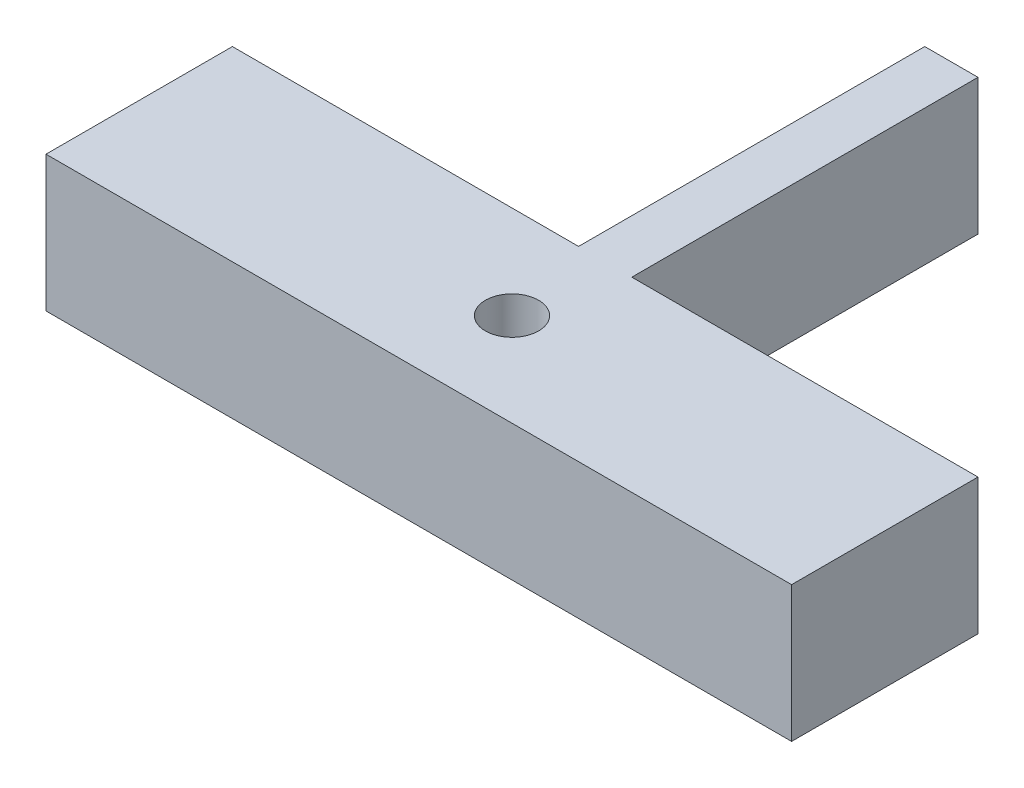
ISO-10303-21;
HEADER;
FILE_DESCRIPTION(('STEP AP214'),'2;1');
FILE_NAME('part.step','',(''),(''),'','','');
FILE_SCHEMA(('AUTOMOTIVE_DESIGN { 1 0 10303 214 1 1 1 1 }'));
ENDSEC;
DATA;
#1=APPLICATION_CONTEXT('core data for automotive mechanical design processes');
#2=APPLICATION_PROTOCOL_DEFINITION('international standard','automotive_design',2000,#1);
#3=PRODUCT_CONTEXT('',#1,'mechanical');
#4=PRODUCT('Part','Part','',(#3));
#5=PRODUCT_RELATED_PRODUCT_CATEGORY('part','',(#4));
#6=PRODUCT_DEFINITION_FORMATION('','',#4);
#7=PRODUCT_DEFINITION_CONTEXT('part definition',#1,'design');
#8=PRODUCT_DEFINITION('design','',#6,#7);
#9=PRODUCT_DEFINITION_SHAPE('','',#8);
#10=(LENGTH_UNIT() NAMED_UNIT(*) SI_UNIT(.MILLI.,.METRE.));
#11=(NAMED_UNIT(*) PLANE_ANGLE_UNIT() SI_UNIT($,.RADIAN.));
#12=(NAMED_UNIT(*) SI_UNIT($,.STERADIAN.) SOLID_ANGLE_UNIT());
#13=UNCERTAINTY_MEASURE_WITH_UNIT(LENGTH_MEASURE(1.E-05),#10,'distance_accuracy_value','');
#14=(GEOMETRIC_REPRESENTATION_CONTEXT(3) GLOBAL_UNCERTAINTY_ASSIGNED_CONTEXT((#13)) GLOBAL_UNIT_ASSIGNED_CONTEXT((#10,
#11,#12)) REPRESENTATION_CONTEXT('',''));
#15=CARTESIAN_POINT('',(0.,0.,0.));
#16=DIRECTION('',(0.,0.,1.));
#17=DIRECTION('',(1.,0.,0.));
#18=AXIS2_PLACEMENT_3D('',#15,#16,#17);
#19=CARTESIAN_POINT('',(-10.,25.5,-100.));
#20=DIRECTION('',(1.,0.,0.));
#21=DIRECTION('',(0.,0.,-1.));
#22=AXIS2_PLACEMENT_3D('',#19,#20,#21);
#23=PLANE('',#22);
#24=DIRECTION('',(0.,0.,1.));
#25=VECTOR('',#24,1.);
#26=CARTESIAN_POINT('',(-10.,-25.5,-100.));
#27=LINE('',#26,#25);
#28=CARTESIAN_POINT('',(-10.,-25.5,-100.));
#29=VERTEX_POINT('',#28);
#30=CARTESIAN_POINT('',(-9.99999999999996,-25.5,30.));
#31=VERTEX_POINT('',#30);
#32=EDGE_CURVE('E131',#29,#31,#27,.T.);
#33=ORIENTED_EDGE('',*,*,#32,.T.);
#34=DIRECTION('',(0.,-1.,0.));
#35=VECTOR('',#34,1.);
#36=CARTESIAN_POINT('',(-9.99999999999996,25.5,30.));
#37=LINE('',#36,#35);
#38=CARTESIAN_POINT('',(-9.99999999999996,25.5,30.));
#39=VERTEX_POINT('',#38);
#40=EDGE_CURVE('E11',#39,#31,#37,.T.);
#41=ORIENTED_EDGE('',*,*,#40,.F.);
#42=DIRECTION('',(0.,0.,1.));
#43=VECTOR('',#42,1.);
#44=CARTESIAN_POINT('',(-10.,25.5,-100.));
#45=LINE('',#44,#43);
#46=CARTESIAN_POINT('',(-10.,25.5,-100.));
#47=VERTEX_POINT('',#46);
#48=EDGE_CURVE('E146',#47,#39,#45,.T.);
#49=ORIENTED_EDGE('',*,*,#48,.F.);
#50=DIRECTION('',(0.,-1.,0.));
#51=VECTOR('',#50,1.);
#52=CARTESIAN_POINT('',(-10.,25.5,-100.));
#53=LINE('',#52,#51);
#54=EDGE_CURVE('E127',#47,#29,#53,.T.);
#55=ORIENTED_EDGE('',*,*,#54,.T.);
#56=EDGE_LOOP('',(#33,#41,#49,#55));
#57=FACE_BOUND('',#56,.T.);
#58=ADVANCED_FACE('F35',(#57),#23,.F.);
#59=CARTESIAN_POINT('',(-9.99999999999996,25.5,30.));
#60=DIRECTION('',(0.,0.,1.));
#61=DIRECTION('',(1.,0.,0.));
#62=AXIS2_PLACEMENT_3D('',#59,#60,#61);
#63=PLANE('',#62);
#64=DIRECTION('',(-1.,0.,0.));
#65=VECTOR('',#64,1.);
#66=CARTESIAN_POINT('',(-9.99999999999996,-25.5,30.));
#67=LINE('',#66,#65);
#68=CARTESIAN_POINT('',(-140.,-25.5,30.));
#69=VERTEX_POINT('',#68);
#70=EDGE_CURVE('E134',#31,#69,#67,.T.);
#71=ORIENTED_EDGE('',*,*,#70,.T.);
#72=DIRECTION('',(0.,-1.,0.));
#73=VECTOR('',#72,1.);
#74=CARTESIAN_POINT('',(-140.,25.5,30.));
#75=LINE('',#74,#73);
#76=CARTESIAN_POINT('',(-140.,25.5,30.));
#77=VERTEX_POINT('',#76);
#78=EDGE_CURVE('E43',#77,#69,#75,.T.);
#79=ORIENTED_EDGE('',*,*,#78,.F.);
#80=DIRECTION('',(-1.,0.,0.));
#81=VECTOR('',#80,1.);
#82=CARTESIAN_POINT('',(-9.99999999999996,25.5,30.));
#83=LINE('',#82,#81);
#84=EDGE_CURVE('E94',#39,#77,#83,.T.);
#85=ORIENTED_EDGE('',*,*,#84,.F.);
#86=ORIENTED_EDGE('',*,*,#40,.T.);
#87=EDGE_LOOP('',(#71,#79,#85,#86));
#88=FACE_BOUND('',#87,.T.);
#89=ADVANCED_FACE('F200',(#88),#63,.F.);
#90=CARTESIAN_POINT('',(-140.,25.5,30.));
#91=DIRECTION('',(1.,0.,0.));
#92=DIRECTION('',(0.,0.,-1.));
#93=AXIS2_PLACEMENT_3D('',#90,#91,#92);
#94=PLANE('',#93);
#95=DIRECTION('',(0.,0.,1.));
#96=VECTOR('',#95,1.);
#97=CARTESIAN_POINT('',(-140.,-25.5,30.));
#98=LINE('',#97,#96);
#99=CARTESIAN_POINT('',(-140.,-25.5,100.));
#100=VERTEX_POINT('',#99);
#101=EDGE_CURVE('E137',#69,#100,#98,.T.);
#102=ORIENTED_EDGE('',*,*,#101,.T.);
#103=DIRECTION('',(0.,-1.,0.));
#104=VECTOR('',#103,1.);
#105=CARTESIAN_POINT('',(-140.,25.5,100.));
#106=LINE('',#105,#104);
#107=CARTESIAN_POINT('',(-140.,25.5,100.));
#108=VERTEX_POINT('',#107);
#109=EDGE_CURVE('E153',#108,#100,#106,.T.);
#110=ORIENTED_EDGE('',*,*,#109,.F.);
#111=DIRECTION('',(0.,0.,1.));
#112=VECTOR('',#111,1.);
#113=CARTESIAN_POINT('',(-140.,25.5,30.));
#114=LINE('',#113,#112);
#115=EDGE_CURVE('E161',#77,#108,#114,.T.);
#116=ORIENTED_EDGE('',*,*,#115,.F.);
#117=ORIENTED_EDGE('',*,*,#78,.T.);
#118=EDGE_LOOP('',(#102,#110,#116,#117));
#119=FACE_BOUND('',#118,.T.);
#120=ADVANCED_FACE('F159',(#119),#94,.F.);
#121=CARTESIAN_POINT('',(-140.,25.5,100.));
#122=DIRECTION('',(0.,0.,-1.));
#123=DIRECTION('',(-1.,0.,0.));
#124=AXIS2_PLACEMENT_3D('',#121,#122,#123);
#125=PLANE('',#124);
#126=DIRECTION('',(1.,0.,0.));
#127=VECTOR('',#126,1.);
#128=CARTESIAN_POINT('',(-140.,-25.5,100.));
#129=LINE('',#128,#127);
#130=CARTESIAN_POINT('',(140.,-25.5,100.));
#131=VERTEX_POINT('',#130);
#132=EDGE_CURVE('E139',#100,#131,#129,.T.);
#133=ORIENTED_EDGE('',*,*,#132,.T.);
#134=DIRECTION('',(0.,-1.,0.));
#135=VECTOR('',#134,1.);
#136=CARTESIAN_POINT('',(140.,25.5,100.));
#137=LINE('',#136,#135);
#138=CARTESIAN_POINT('',(140.,25.5,100.));
#139=VERTEX_POINT('',#138);
#140=EDGE_CURVE('E150',#139,#131,#137,.T.);
#141=ORIENTED_EDGE('',*,*,#140,.F.);
#142=DIRECTION('',(1.,0.,0.));
#143=VECTOR('',#142,1.);
#144=CARTESIAN_POINT('',(-140.,25.5,100.));
#145=LINE('',#144,#143);
#146=EDGE_CURVE('E173',#108,#139,#145,.T.);
#147=ORIENTED_EDGE('',*,*,#146,.F.);
#148=ORIENTED_EDGE('',*,*,#109,.T.);
#149=EDGE_LOOP('',(#133,#141,#147,#148));
#150=FACE_BOUND('',#149,.T.);
#151=ADVANCED_FACE('F169',(#150),#125,.F.);
#152=CARTESIAN_POINT('',(140.,25.5,30.));
#153=DIRECTION('',(-1.,0.,0.));
#154=DIRECTION('',(0.,0.,1.));
#155=AXIS2_PLACEMENT_3D('',#152,#153,#154);
#156=PLANE('',#155);
#157=DIRECTION('',(0.,0.,-1.));
#158=VECTOR('',#157,1.);
#159=CARTESIAN_POINT('',(140.,-25.5,30.));
#160=LINE('',#159,#158);
#161=CARTESIAN_POINT('',(140.,-25.5,30.));
#162=VERTEX_POINT('',#161);
#163=EDGE_CURVE('E141',#131,#162,#160,.T.);
#164=ORIENTED_EDGE('',*,*,#163,.T.);
#165=DIRECTION('',(0.,-1.,0.));
#166=VECTOR('',#165,1.);
#167=CARTESIAN_POINT('',(140.,25.5,30.));
#168=LINE('',#167,#166);
#169=CARTESIAN_POINT('',(140.,25.5,30.));
#170=VERTEX_POINT('',#169);
#171=EDGE_CURVE('E122',#170,#162,#168,.T.);
#172=ORIENTED_EDGE('',*,*,#171,.F.);
#173=DIRECTION('',(0.,0.,-1.));
#174=VECTOR('',#173,1.);
#175=CARTESIAN_POINT('',(140.,25.5,30.));
#176=LINE('',#175,#174);
#177=EDGE_CURVE('E113',#139,#170,#176,.T.);
#178=ORIENTED_EDGE('',*,*,#177,.F.);
#179=ORIENTED_EDGE('',*,*,#140,.T.);
#180=EDGE_LOOP('',(#164,#172,#178,#179));
#181=FACE_BOUND('',#180,.T.);
#182=ADVANCED_FACE('F172',(#181),#156,.F.);
#183=CARTESIAN_POINT('',(9.99999999999999,25.5,30.));
#184=DIRECTION('',(0.,0.,1.));
#185=DIRECTION('',(1.,0.,0.));
#186=AXIS2_PLACEMENT_3D('',#183,#184,#185);
#187=PLANE('',#186);
#188=DIRECTION('',(-1.,0.,0.));
#189=VECTOR('',#188,1.);
#190=CARTESIAN_POINT('',(9.99999999999999,-25.5,30.));
#191=LINE('',#190,#189);
#192=CARTESIAN_POINT('',(9.99999999999999,-25.5,30.));
#193=VERTEX_POINT('',#192);
#194=EDGE_CURVE('E121',#162,#193,#191,.T.);
#195=ORIENTED_EDGE('',*,*,#194,.T.);
#196=DIRECTION('',(0.,-1.,0.));
#197=VECTOR('',#196,1.);
#198=CARTESIAN_POINT('',(9.99999999999999,25.5,30.));
#199=LINE('',#198,#197);
#200=CARTESIAN_POINT('',(9.99999999999999,25.5,30.));
#201=VERTEX_POINT('',#200);
#202=EDGE_CURVE('E118',#201,#193,#199,.T.);
#203=ORIENTED_EDGE('',*,*,#202,.F.);
#204=DIRECTION('',(-1.,0.,0.));
#205=VECTOR('',#204,1.);
#206=CARTESIAN_POINT('',(9.99999999999999,25.5,30.));
#207=LINE('',#206,#205);
#208=EDGE_CURVE('E107',#170,#201,#207,.T.);
#209=ORIENTED_EDGE('',*,*,#208,.F.);
#210=ORIENTED_EDGE('',*,*,#171,.T.);
#211=EDGE_LOOP('',(#195,#203,#209,#210));
#212=FACE_BOUND('',#211,.T.);
#213=ADVANCED_FACE('F119',(#212),#187,.F.);
#214=CARTESIAN_POINT('',(10.,25.5,-100.));
#215=DIRECTION('',(-1.,0.,0.));
#216=DIRECTION('',(0.,0.,1.));
#217=AXIS2_PLACEMENT_3D('',#214,#215,#216);
#218=PLANE('',#217);
#219=DIRECTION('',(0.,0.,-1.));
#220=VECTOR('',#219,1.);
#221=CARTESIAN_POINT('',(10.,-25.5,-100.));
#222=LINE('',#221,#220);
#223=CARTESIAN_POINT('',(10.,-25.5,-100.));
#224=VERTEX_POINT('',#223);
#225=EDGE_CURVE('E80',#193,#224,#222,.T.);
#226=ORIENTED_EDGE('',*,*,#225,.T.);
#227=DIRECTION('',(0.,-1.,0.));
#228=VECTOR('',#227,1.);
#229=CARTESIAN_POINT('',(10.,25.5,-100.));
#230=LINE('',#229,#228);
#231=CARTESIAN_POINT('',(10.,25.5,-100.));
#232=VERTEX_POINT('',#231);
#233=EDGE_CURVE('E123',#232,#224,#230,.T.);
#234=ORIENTED_EDGE('',*,*,#233,.F.);
#235=DIRECTION('',(0.,0.,-1.));
#236=VECTOR('',#235,1.);
#237=CARTESIAN_POINT('',(10.,25.5,-100.));
#238=LINE('',#237,#236);
#239=EDGE_CURVE('E111',#201,#232,#238,.T.);
#240=ORIENTED_EDGE('',*,*,#239,.F.);
#241=ORIENTED_EDGE('',*,*,#202,.T.);
#242=EDGE_LOOP('',(#226,#234,#240,#241));
#243=FACE_BOUND('',#242,.T.);
#244=ADVANCED_FACE('F125',(#243),#218,.F.);
#245=CARTESIAN_POINT('',(10.,25.5,-100.));
#246=DIRECTION('',(0.,0.,1.));
#247=DIRECTION('',(1.,0.,0.));
#248=AXIS2_PLACEMENT_3D('',#245,#246,#247);
#249=PLANE('',#248);
#250=DIRECTION('',(-1.,0.,0.));
#251=VECTOR('',#250,1.);
#252=CARTESIAN_POINT('',(10.,-25.5,-100.));
#253=LINE('',#252,#251);
#254=EDGE_CURVE('E86',#224,#29,#253,.T.);
#255=ORIENTED_EDGE('',*,*,#254,.T.);
#256=ORIENTED_EDGE('',*,*,#54,.F.);
#257=DIRECTION('',(-1.,0.,0.));
#258=VECTOR('',#257,1.);
#259=CARTESIAN_POINT('',(10.,25.5,-100.));
#260=LINE('',#259,#258);
#261=EDGE_CURVE('E51',#232,#47,#260,.T.);
#262=ORIENTED_EDGE('',*,*,#261,.F.);
#263=ORIENTED_EDGE('',*,*,#233,.T.);
#264=EDGE_LOOP('',(#255,#256,#262,#263));
#265=FACE_BOUND('',#264,.T.);
#266=ADVANCED_FACE('F188',(#265),#249,.F.);
#267=CARTESIAN_POINT('',(0.,25.5,0.));
#268=DIRECTION('',(0.,-1.,0.));
#269=DIRECTION('',(0.,0.,-1.));
#270=AXIS2_PLACEMENT_3D('',#267,#268,#269);
#271=PLANE('',#270);
#272=CARTESIAN_POINT('',(0.,25.5,65.));
#273=DIRECTION('',(0.,1.,0.));
#274=DIRECTION('',(0.,0.,1.));
#275=AXIS2_PLACEMENT_3D('',#272,#273,#274);
#276=CIRCLE('',#275,10.);
#277=CARTESIAN_POINT('',(0.,25.5,75.));
#278=VERTEX_POINT('',#277);
#279=EDGE_CURVE('E181',#278,#278,#276,.T.);
#280=ORIENTED_EDGE('',*,*,#279,.F.);
#281=EDGE_LOOP('',(#280));
#282=FACE_BOUND('',#281,.T.);
#283=ORIENTED_EDGE('',*,*,#48,.T.);
#284=ORIENTED_EDGE('',*,*,#84,.T.);
#285=ORIENTED_EDGE('',*,*,#115,.T.);
#286=ORIENTED_EDGE('',*,*,#146,.T.);
#287=ORIENTED_EDGE('',*,*,#177,.T.);
#288=ORIENTED_EDGE('',*,*,#208,.T.);
#289=ORIENTED_EDGE('',*,*,#239,.T.);
#290=ORIENTED_EDGE('',*,*,#261,.T.);
#291=EDGE_LOOP('',(#283,#284,#285,#286,#287,#288,#289,#290));
#292=FACE_BOUND('',#291,.T.);
#293=ADVANCED_FACE('F109',(#282,#292),#271,.F.);
#294=CARTESIAN_POINT('',(0.,-25.5,0.));
#295=DIRECTION('',(0.,-1.,0.));
#296=DIRECTION('',(0.,0.,-1.));
#297=AXIS2_PLACEMENT_3D('',#294,#295,#296);
#298=PLANE('',#297);
#299=CARTESIAN_POINT('',(0.,-25.5,65.));
#300=DIRECTION('',(0.,1.,0.));
#301=DIRECTION('',(0.,0.,1.));
#302=AXIS2_PLACEMENT_3D('',#299,#300,#301);
#303=CIRCLE('',#302,10.);
#304=CARTESIAN_POINT('',(0.,-25.5,75.));
#305=VERTEX_POINT('',#304);
#306=EDGE_CURVE('E135',#305,#305,#303,.T.);
#307=ORIENTED_EDGE('',*,*,#306,.T.);
#308=EDGE_LOOP('',(#307));
#309=FACE_BOUND('',#308,.T.);
#310=ORIENTED_EDGE('',*,*,#32,.F.);
#311=ORIENTED_EDGE('',*,*,#254,.F.);
#312=ORIENTED_EDGE('',*,*,#225,.F.);
#313=ORIENTED_EDGE('',*,*,#194,.F.);
#314=ORIENTED_EDGE('',*,*,#163,.F.);
#315=ORIENTED_EDGE('',*,*,#132,.F.);
#316=ORIENTED_EDGE('',*,*,#101,.F.);
#317=ORIENTED_EDGE('',*,*,#70,.F.);
#318=EDGE_LOOP('',(#310,#311,#312,#313,#314,#315,#316,#317));
#319=FACE_BOUND('',#318,.T.);
#320=ADVANCED_FACE('F165',(#309,#319),#298,.T.);
#321=CARTESIAN_POINT('',(0.,-25.5,65.));
#322=DIRECTION('',(0.,1.,0.));
#323=DIRECTION('',(0.,0.,1.));
#324=AXIS2_PLACEMENT_3D('',#321,#322,#323);
#325=CYLINDRICAL_SURFACE('',#324,10.);
#326=ORIENTED_EDGE('',*,*,#306,.F.);
#327=EDGE_LOOP('',(#326));
#328=FACE_BOUND('',#327,.T.);
#329=ORIENTED_EDGE('',*,*,#279,.T.);
#330=EDGE_LOOP('',(#329));
#331=FACE_BOUND('',#330,.T.);
#332=ADVANCED_FACE('F185',(#328,#331),#325,.F.);
#333=CLOSED_SHELL('',(#58,#89,#120,#151,#182,#213,#244,#266,#293,#320,#332));
#334=MANIFOLD_SOLID_BREP('B2',#333);
#335=ADVANCED_BREP_SHAPE_REPRESENTATION('',(#18,#334),#14);
#336=SHAPE_DEFINITION_REPRESENTATION(#9,#335);
ENDSEC;
END-ISO-10303-21;
